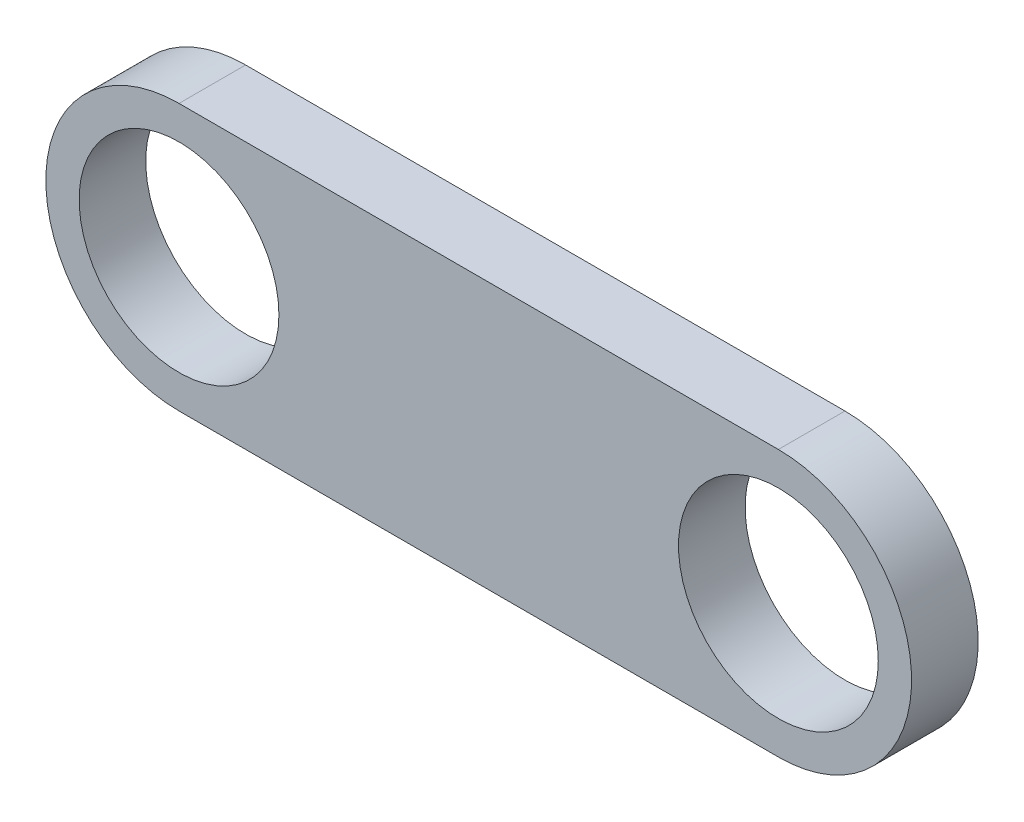
ISO-10303-21;
HEADER;
FILE_DESCRIPTION(('STEP AP214'),'2;1');
FILE_NAME('part.step','',(''),(''),'','','');
FILE_SCHEMA(('AUTOMOTIVE_DESIGN { 1 0 10303 214 1 1 1 1 }'));
ENDSEC;
DATA;
#1=APPLICATION_CONTEXT('core data for automotive mechanical design processes');
#2=APPLICATION_PROTOCOL_DEFINITION('international standard','automotive_design',2000,#1);
#3=PRODUCT_CONTEXT('',#1,'mechanical');
#4=PRODUCT('Part','Part','',(#3));
#5=PRODUCT_RELATED_PRODUCT_CATEGORY('part','',(#4));
#6=PRODUCT_DEFINITION_FORMATION('','',#4);
#7=PRODUCT_DEFINITION_CONTEXT('part definition',#1,'design');
#8=PRODUCT_DEFINITION('design','',#6,#7);
#9=PRODUCT_DEFINITION_SHAPE('','',#8);
#10=(LENGTH_UNIT() NAMED_UNIT(*) SI_UNIT(.MILLI.,.METRE.));
#11=(NAMED_UNIT(*) PLANE_ANGLE_UNIT() SI_UNIT($,.RADIAN.));
#12=(NAMED_UNIT(*) SI_UNIT($,.STERADIAN.) SOLID_ANGLE_UNIT());
#13=UNCERTAINTY_MEASURE_WITH_UNIT(LENGTH_MEASURE(1.E-05),#10,'distance_accuracy_value','');
#14=(GEOMETRIC_REPRESENTATION_CONTEXT(3) GLOBAL_UNCERTAINTY_ASSIGNED_CONTEXT((#13)) GLOBAL_UNIT_ASSIGNED_CONTEXT((#10,
#11,#12)) REPRESENTATION_CONTEXT('',''));
#15=CARTESIAN_POINT('',(0.,0.,0.));
#16=DIRECTION('',(0.,0.,1.));
#17=DIRECTION('',(1.,0.,0.));
#18=AXIS2_PLACEMENT_3D('',#15,#16,#17);
#19=CARTESIAN_POINT('',(0.,0.,10.));
#20=DIRECTION('',(0.,0.,1.));
#21=DIRECTION('',(1.,0.,0.));
#22=AXIS2_PLACEMENT_3D('',#19,#20,#21);
#23=PLANE('',#22);
#24=CARTESIAN_POINT('',(0.,0.,10.));
#25=DIRECTION('',(0.,0.,1.));
#26=DIRECTION('',(1.,0.,0.));
#27=AXIS2_PLACEMENT_3D('',#24,#25,#26);
#28=CIRCLE('',#27,15.);
#29=CARTESIAN_POINT('',(15.,0.,10.));
#30=VERTEX_POINT('',#29);
#31=EDGE_CURVE('E104',#30,#30,#28,.T.);
#32=ORIENTED_EDGE('',*,*,#31,.F.);
#33=EDGE_LOOP('',(#32));
#34=FACE_BOUND('',#33,.T.);
#35=CARTESIAN_POINT('',(0.,0.,10.));
#36=DIRECTION('',(0.,0.,1.));
#37=DIRECTION('',(1.,0.,0.));
#38=AXIS2_PLACEMENT_3D('',#35,#36,#37);
#39=CIRCLE('',#38,20.0000000000001);
#40=CARTESIAN_POINT('',(0.,20.,10.));
#41=VERTEX_POINT('',#40);
#42=CARTESIAN_POINT('',(0.,-20.0000000000001,10.));
#43=VERTEX_POINT('',#42);
#44=EDGE_CURVE('E89',#41,#43,#39,.T.);
#45=ORIENTED_EDGE('',*,*,#44,.T.);
#46=DIRECTION('',(1.,0.,0.));
#47=VECTOR('',#46,1.);
#48=CARTESIAN_POINT('',(0.,-20.0000000000001,10.));
#49=LINE('',#48,#47);
#50=CARTESIAN_POINT('',(90.,-20.,10.));
#51=VERTEX_POINT('',#50);
#52=EDGE_CURVE('E84',#43,#51,#49,.T.);
#53=ORIENTED_EDGE('',*,*,#52,.T.);
#54=CARTESIAN_POINT('',(90.,0.,10.));
#55=DIRECTION('',(0.,0.,1.));
#56=DIRECTION('',(1.,0.,0.));
#57=AXIS2_PLACEMENT_3D('',#54,#55,#56);
#58=CIRCLE('',#57,20.);
#59=CARTESIAN_POINT('',(90.,20.,10.));
#60=VERTEX_POINT('',#59);
#61=EDGE_CURVE('E87',#51,#60,#58,.T.);
#62=ORIENTED_EDGE('',*,*,#61,.T.);
#63=DIRECTION('',(-1.,0.,0.));
#64=VECTOR('',#63,1.);
#65=CARTESIAN_POINT('',(0.,20.,10.));
#66=LINE('',#65,#64);
#67=EDGE_CURVE('E54',#60,#41,#66,.T.);
#68=ORIENTED_EDGE('',*,*,#67,.T.);
#69=EDGE_LOOP('',(#45,#53,#62,#68));
#70=FACE_BOUND('',#69,.T.);
#71=CARTESIAN_POINT('',(90.,0.,10.));
#72=DIRECTION('',(0.,0.,1.));
#73=DIRECTION('',(1.,0.,0.));
#74=AXIS2_PLACEMENT_3D('',#71,#72,#73);
#75=CIRCLE('',#74,15.);
#76=CARTESIAN_POINT('',(105.,0.,10.));
#77=VERTEX_POINT('',#76);
#78=EDGE_CURVE('E119',#77,#77,#75,.T.);
#79=ORIENTED_EDGE('',*,*,#78,.F.);
#80=EDGE_LOOP('',(#79));
#81=FACE_BOUND('',#80,.T.);
#82=ADVANCED_FACE('F37',(#34,#70,#81),#23,.T.);
#83=CARTESIAN_POINT('',(0.,0.,0.));
#84=DIRECTION('',(0.,0.,1.));
#85=DIRECTION('',(1.,0.,0.));
#86=AXIS2_PLACEMENT_3D('',#83,#84,#85);
#87=PLANE('',#86);
#88=CARTESIAN_POINT('',(0.,0.,0.));
#89=DIRECTION('',(0.,0.,1.));
#90=DIRECTION('',(1.,0.,0.));
#91=AXIS2_PLACEMENT_3D('',#88,#89,#90);
#92=CIRCLE('',#91,20.0000000000001);
#93=CARTESIAN_POINT('',(0.,20.,0.));
#94=VERTEX_POINT('',#93);
#95=CARTESIAN_POINT('',(0.,-20.0000000000001,0.));
#96=VERTEX_POINT('',#95);
#97=EDGE_CURVE('E101',#94,#96,#92,.T.);
#98=ORIENTED_EDGE('',*,*,#97,.F.);
#99=DIRECTION('',(-1.,0.,0.));
#100=VECTOR('',#99,1.);
#101=CARTESIAN_POINT('',(0.,20.,0.));
#102=LINE('',#101,#100);
#103=CARTESIAN_POINT('',(90.,20.,0.));
#104=VERTEX_POINT('',#103);
#105=EDGE_CURVE('E77',#104,#94,#102,.T.);
#106=ORIENTED_EDGE('',*,*,#105,.F.);
#107=CARTESIAN_POINT('',(90.,0.,0.));
#108=DIRECTION('',(0.,0.,1.));
#109=DIRECTION('',(1.,0.,0.));
#110=AXIS2_PLACEMENT_3D('',#107,#108,#109);
#111=CIRCLE('',#110,20.);
#112=CARTESIAN_POINT('',(90.,-20.,0.));
#113=VERTEX_POINT('',#112);
#114=EDGE_CURVE('E71',#113,#104,#111,.T.);
#115=ORIENTED_EDGE('',*,*,#114,.F.);
#116=DIRECTION('',(1.,0.,0.));
#117=VECTOR('',#116,1.);
#118=CARTESIAN_POINT('',(0.,-20.0000000000001,0.));
#119=LINE('',#118,#117);
#120=EDGE_CURVE('E93',#96,#113,#119,.T.);
#121=ORIENTED_EDGE('',*,*,#120,.F.);
#122=EDGE_LOOP('',(#98,#106,#115,#121));
#123=FACE_BOUND('',#122,.T.);
#124=CARTESIAN_POINT('',(0.,0.,0.));
#125=DIRECTION('',(0.,0.,1.));
#126=DIRECTION('',(1.,0.,0.));
#127=AXIS2_PLACEMENT_3D('',#124,#125,#126);
#128=CIRCLE('',#127,15.);
#129=CARTESIAN_POINT('',(15.,0.,0.));
#130=VERTEX_POINT('',#129);
#131=EDGE_CURVE('E116',#130,#130,#128,.T.);
#132=ORIENTED_EDGE('',*,*,#131,.T.);
#133=EDGE_LOOP('',(#132));
#134=FACE_BOUND('',#133,.T.);
#135=CARTESIAN_POINT('',(90.,0.,0.));
#136=DIRECTION('',(0.,0.,1.));
#137=DIRECTION('',(1.,0.,0.));
#138=AXIS2_PLACEMENT_3D('',#135,#136,#137);
#139=CIRCLE('',#138,15.);
#140=CARTESIAN_POINT('',(105.,0.,0.));
#141=VERTEX_POINT('',#140);
#142=EDGE_CURVE('E122',#141,#141,#139,.T.);
#143=ORIENTED_EDGE('',*,*,#142,.T.);
#144=EDGE_LOOP('',(#143));
#145=FACE_BOUND('',#144,.T.);
#146=ADVANCED_FACE('F112',(#123,#134,#145),#87,.F.);
#147=CARTESIAN_POINT('',(0.,0.,10.));
#148=DIRECTION('',(0.,0.,-1.));
#149=DIRECTION('',(-1.,0.,0.));
#150=AXIS2_PLACEMENT_3D('',#147,#148,#149);
#151=CYLINDRICAL_SURFACE('',#150,20.0000000000001);
#152=ORIENTED_EDGE('',*,*,#97,.T.);
#153=DIRECTION('',(0.,0.,-1.));
#154=VECTOR('',#153,1.);
#155=CARTESIAN_POINT('',(0.,-20.0000000000001,10.));
#156=LINE('',#155,#154);
#157=EDGE_CURVE('E11',#43,#96,#156,.T.);
#158=ORIENTED_EDGE('',*,*,#157,.F.);
#159=ORIENTED_EDGE('',*,*,#44,.F.);
#160=DIRECTION('',(0.,0.,-1.));
#161=VECTOR('',#160,1.);
#162=CARTESIAN_POINT('',(0.,20.,10.));
#163=LINE('',#162,#161);
#164=EDGE_CURVE('E97',#41,#94,#163,.T.);
#165=ORIENTED_EDGE('',*,*,#164,.T.);
#166=EDGE_LOOP('',(#152,#158,#159,#165));
#167=FACE_BOUND('',#166,.T.);
#168=ADVANCED_FACE('F39',(#167),#151,.T.);
#169=CARTESIAN_POINT('',(0.,-20.0000000000001,10.));
#170=DIRECTION('',(0.,1.,0.));
#171=DIRECTION('',(-1.,0.,0.));
#172=AXIS2_PLACEMENT_3D('',#169,#170,#171);
#173=PLANE('',#172);
#174=ORIENTED_EDGE('',*,*,#120,.T.);
#175=DIRECTION('',(0.,0.,-1.));
#176=VECTOR('',#175,1.);
#177=CARTESIAN_POINT('',(90.,-20.,10.));
#178=LINE('',#177,#176);
#179=EDGE_CURVE('E46',#51,#113,#178,.T.);
#180=ORIENTED_EDGE('',*,*,#179,.F.);
#181=ORIENTED_EDGE('',*,*,#52,.F.);
#182=ORIENTED_EDGE('',*,*,#157,.T.);
#183=EDGE_LOOP('',(#174,#180,#181,#182));
#184=FACE_BOUND('',#183,.T.);
#185=ADVANCED_FACE('F92',(#184),#173,.F.);
#186=CARTESIAN_POINT('',(90.,0.,10.));
#187=DIRECTION('',(0.,0.,-1.));
#188=DIRECTION('',(-1.,0.,0.));
#189=AXIS2_PLACEMENT_3D('',#186,#187,#188);
#190=CYLINDRICAL_SURFACE('',#189,20.);
#191=ORIENTED_EDGE('',*,*,#114,.T.);
#192=DIRECTION('',(0.,0.,-1.));
#193=VECTOR('',#192,1.);
#194=CARTESIAN_POINT('',(90.,20.,10.));
#195=LINE('',#194,#193);
#196=EDGE_CURVE('E94',#60,#104,#195,.T.);
#197=ORIENTED_EDGE('',*,*,#196,.F.);
#198=ORIENTED_EDGE('',*,*,#61,.F.);
#199=ORIENTED_EDGE('',*,*,#179,.T.);
#200=EDGE_LOOP('',(#191,#197,#198,#199));
#201=FACE_BOUND('',#200,.T.);
#202=ADVANCED_FACE('F95',(#201),#190,.T.);
#203=CARTESIAN_POINT('',(0.,20.,10.));
#204=DIRECTION('',(0.,-1.,0.));
#205=DIRECTION('',(1.,0.,0.));
#206=AXIS2_PLACEMENT_3D('',#203,#204,#205);
#207=PLANE('',#206);
#208=ORIENTED_EDGE('',*,*,#105,.T.);
#209=ORIENTED_EDGE('',*,*,#164,.F.);
#210=ORIENTED_EDGE('',*,*,#67,.F.);
#211=ORIENTED_EDGE('',*,*,#196,.T.);
#212=EDGE_LOOP('',(#208,#209,#210,#211));
#213=FACE_BOUND('',#212,.T.);
#214=ADVANCED_FACE('F109',(#213),#207,.F.);
#215=CARTESIAN_POINT('',(0.,0.,10.));
#216=DIRECTION('',(0.,0.,-1.));
#217=DIRECTION('',(-1.,0.,0.));
#218=AXIS2_PLACEMENT_3D('',#215,#216,#217);
#219=CYLINDRICAL_SURFACE('',#218,15.);
#220=ORIENTED_EDGE('',*,*,#31,.T.);
#221=EDGE_LOOP('',(#220));
#222=FACE_BOUND('',#221,.T.);
#223=ORIENTED_EDGE('',*,*,#131,.F.);
#224=EDGE_LOOP('',(#223));
#225=FACE_BOUND('',#224,.T.);
#226=ADVANCED_FACE('F139',(#222,#225),#219,.F.);
#227=CARTESIAN_POINT('',(90.,0.,10.));
#228=DIRECTION('',(0.,0.,-1.));
#229=DIRECTION('',(-1.,0.,0.));
#230=AXIS2_PLACEMENT_3D('',#227,#228,#229);
#231=CYLINDRICAL_SURFACE('',#230,15.);
#232=ORIENTED_EDGE('',*,*,#78,.T.);
#233=EDGE_LOOP('',(#232));
#234=FACE_BOUND('',#233,.T.);
#235=ORIENTED_EDGE('',*,*,#142,.F.);
#236=EDGE_LOOP('',(#235));
#237=FACE_BOUND('',#236,.T.);
#238=ADVANCED_FACE('F128',(#234,#237),#231,.F.);
#239=CLOSED_SHELL('',(#82,#146,#168,#185,#202,#214,#226,#238));
#240=MANIFOLD_SOLID_BREP('B2',#239);
#241=ADVANCED_BREP_SHAPE_REPRESENTATION('',(#18,#240),#14);
#242=SHAPE_DEFINITION_REPRESENTATION(#9,#241);
ENDSEC;
END-ISO-10303-21;
